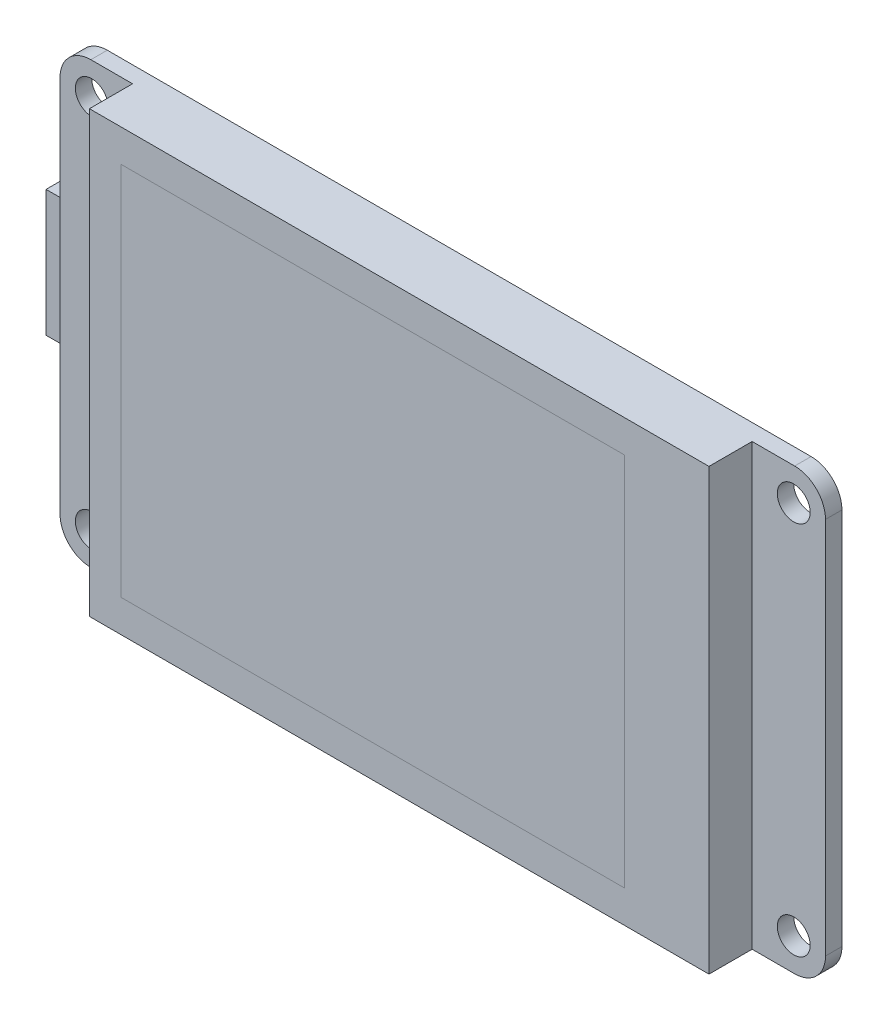
ISO-10303-21;
HEADER;
FILE_DESCRIPTION(('STEP AP214'),'2;1');
FILE_NAME('part.step','',(''),(''),'','','');
FILE_SCHEMA(('AUTOMOTIVE_DESIGN { 1 0 10303 214 1 1 1 1 }'));
ENDSEC;
DATA;
#1=APPLICATION_CONTEXT('core data for automotive mechanical design processes');
#2=APPLICATION_PROTOCOL_DEFINITION('international standard','automotive_design',2000,#1);
#3=PRODUCT_CONTEXT('',#1,'mechanical');
#4=PRODUCT('Part','Part','',(#3));
#5=PRODUCT_RELATED_PRODUCT_CATEGORY('part','',(#4));
#6=PRODUCT_DEFINITION_FORMATION('','',#4);
#7=PRODUCT_DEFINITION_CONTEXT('part definition',#1,'design');
#8=PRODUCT_DEFINITION('design','',#6,#7);
#9=PRODUCT_DEFINITION_SHAPE('','',#8);
#10=(LENGTH_UNIT() NAMED_UNIT(*) SI_UNIT(.MILLI.,.METRE.));
#11=(NAMED_UNIT(*) PLANE_ANGLE_UNIT() SI_UNIT($,.RADIAN.));
#12=(NAMED_UNIT(*) SI_UNIT($,.STERADIAN.) SOLID_ANGLE_UNIT());
#13=UNCERTAINTY_MEASURE_WITH_UNIT(LENGTH_MEASURE(1.E-05),#10,'distance_accuracy_value','');
#14=(GEOMETRIC_REPRESENTATION_CONTEXT(3) GLOBAL_UNCERTAINTY_ASSIGNED_CONTEXT((#13)) GLOBAL_UNIT_ASSIGNED_CONTEXT((#10,
#11,#12)) REPRESENTATION_CONTEXT('',''));
#15=CARTESIAN_POINT('',(0.,0.,0.));
#16=DIRECTION('',(0.,0.,1.));
#17=DIRECTION('',(1.,0.,0.));
#18=AXIS2_PLACEMENT_3D('',#15,#16,#17);
#19=CARTESIAN_POINT('',(37.25,-21.4,-1.6002));
#20=DIRECTION('',(0.,-1.,0.));
#21=DIRECTION('',(1.,0.,0.));
#22=AXIS2_PLACEMENT_3D('',#19,#20,#21);
#23=PLANE('',#22);
#24=DIRECTION('',(1.,0.,0.));
#25=VECTOR('',#24,1.);
#26=CARTESIAN_POINT('',(37.25,-21.4,-1.6002));
#27=LINE('',#26,#25);
#28=CARTESIAN_POINT('',(-34.25,-21.4,-1.6002));
#29=VERTEX_POINT('',#28);
#30=CARTESIAN_POINT('',(-23.45,-21.4,-1.6002));
#31=VERTEX_POINT('',#30);
#32=EDGE_CURVE('E495',#29,#31,#27,.T.);
#33=ORIENTED_EDGE('',*,*,#32,.T.);
#34=DIRECTION('',(0.,0.,1.));
#35=VECTOR('',#34,1.);
#36=CARTESIAN_POINT('',(-23.45,-21.4,-3.7502));
#37=LINE('',#36,#35);
#38=CARTESIAN_POINT('',(-23.45,-21.4,-3.7502));
#39=VERTEX_POINT('',#38);
#40=EDGE_CURVE('E284',#39,#31,#37,.T.);
#41=ORIENTED_EDGE('',*,*,#40,.F.);
#42=DIRECTION('',(-1.,0.,0.));
#43=VECTOR('',#42,1.);
#44=CARTESIAN_POINT('',(-23.45,-21.4,-3.7502));
#45=LINE('',#44,#43);
#46=CARTESIAN_POINT('',(-8.54999999999999,-21.4,-3.7502));
#47=VERTEX_POINT('',#46);
#48=EDGE_CURVE('E270',#47,#39,#45,.T.);
#49=ORIENTED_EDGE('',*,*,#48,.F.);
#50=DIRECTION('',(0.,0.,1.));
#51=VECTOR('',#50,1.);
#52=CARTESIAN_POINT('',(-8.54999999999999,-21.4,-3.7502));
#53=LINE('',#52,#51);
#54=CARTESIAN_POINT('',(-8.54999999999999,-21.4,-1.6002));
#55=VERTEX_POINT('',#54);
#56=EDGE_CURVE('E286',#47,#55,#53,.T.);
#57=ORIENTED_EDGE('',*,*,#56,.T.);
#58=CARTESIAN_POINT('',(34.25,-21.4,-1.6002));
#59=VERTEX_POINT('',#58);
#60=EDGE_CURVE('E491',#55,#59,#27,.T.);
#61=ORIENTED_EDGE('',*,*,#60,.T.);
#62=DIRECTION('',(0.,0.,1.));
#63=VECTOR('',#62,1.);
#64=CARTESIAN_POINT('',(34.25,-21.4,-1.6002));
#65=LINE('',#64,#63);
#66=CARTESIAN_POINT('',(34.25,-21.4,0.));
#67=VERTEX_POINT('',#66);
#68=EDGE_CURVE('E479',#59,#67,#65,.T.);
#69=ORIENTED_EDGE('',*,*,#68,.T.);
#70=DIRECTION('',(1.,0.,0.));
#71=VECTOR('',#70,1.);
#72=CARTESIAN_POINT('',(37.25,-21.4,0.));
#73=LINE('',#72,#71);
#74=CARTESIAN_POINT('',(30.11,-21.4,0.));
#75=VERTEX_POINT('',#74);
#76=EDGE_CURVE('E441',#75,#67,#73,.T.);
#77=ORIENTED_EDGE('',*,*,#76,.F.);
#78=DIRECTION('',(0.,0.,-1.));
#79=VECTOR('',#78,1.);
#80=CARTESIAN_POINT('',(30.11,-21.4,4.2));
#81=LINE('',#80,#79);
#82=CARTESIAN_POINT('',(30.11,-21.4,4.2));
#83=VERTEX_POINT('',#82);
#84=EDGE_CURVE('E450',#83,#75,#81,.T.);
#85=ORIENTED_EDGE('',*,*,#84,.F.);
#86=DIRECTION('',(1.,0.,0.));
#87=VECTOR('',#86,1.);
#88=CARTESIAN_POINT('',(30.11,-21.4,4.2));
#89=LINE('',#88,#87);
#90=CARTESIAN_POINT('',(-30.19,-21.4,4.2));
#91=VERTEX_POINT('',#90);
#92=EDGE_CURVE('E385',#91,#83,#89,.T.);
#93=ORIENTED_EDGE('',*,*,#92,.F.);
#94=DIRECTION('',(0.,0.,-1.));
#95=VECTOR('',#94,1.);
#96=CARTESIAN_POINT('',(-30.19,-21.4,4.2));
#97=LINE('',#96,#95);
#98=CARTESIAN_POINT('',(-30.19,-21.4,0.));
#99=VERTEX_POINT('',#98);
#100=EDGE_CURVE('E455',#91,#99,#97,.T.);
#101=ORIENTED_EDGE('',*,*,#100,.T.);
#102=CARTESIAN_POINT('',(-34.25,-21.4,0.));
#103=VERTEX_POINT('',#102);
#104=EDGE_CURVE('E467',#103,#99,#73,.T.);
#105=ORIENTED_EDGE('',*,*,#104,.F.);
#106=DIRECTION('',(0.,0.,1.));
#107=VECTOR('',#106,1.);
#108=CARTESIAN_POINT('',(-34.25,-21.4,-1.6002));
#109=LINE('',#108,#107);
#110=EDGE_CURVE('E477',#103,#29,#109,.F.);
#111=ORIENTED_EDGE('',*,*,#110,.T.);
#112=EDGE_LOOP('',(#33,#41,#49,#57,#61,#69,#77,#85,#93,#101,#105,#111));
#113=FACE_BOUND('',#112,.T.);
#114=DIRECTION('',(-1.,0.,0.));
#115=VECTOR('',#114,1.);
#116=CARTESIAN_POINT('',(-20.35,-21.4,-2.6402));
#117=LINE('',#116,#115);
#118=CARTESIAN_POINT('',(-9.31999999999999,-21.4,-2.6402));
#119=VERTEX_POINT('',#118);
#120=CARTESIAN_POINT('',(-20.35,-21.4,-2.6402));
#121=VERTEX_POINT('',#120);
#122=EDGE_CURVE('E798',#119,#121,#117,.T.);
#123=ORIENTED_EDGE('',*,*,#122,.F.);
#124=DIRECTION('',(0.,0.,1.));
#125=VECTOR('',#124,1.);
#126=CARTESIAN_POINT('',(-9.31999999999999,-21.4,-3.7402));
#127=LINE('',#126,#125);
#128=CARTESIAN_POINT('',(-9.31999999999999,-21.4,-3.7402));
#129=VERTEX_POINT('',#128);
#130=EDGE_CURVE('E259',#129,#119,#127,.T.);
#131=ORIENTED_EDGE('',*,*,#130,.F.);
#132=DIRECTION('',(1.,0.,0.));
#133=VECTOR('',#132,1.);
#134=CARTESIAN_POINT('',(-20.35,-21.4,-3.7402));
#135=LINE('',#134,#133);
#136=CARTESIAN_POINT('',(-20.35,-21.4,-3.7402));
#137=VERTEX_POINT('',#136);
#138=EDGE_CURVE('E255',#137,#129,#135,.T.);
#139=ORIENTED_EDGE('',*,*,#138,.F.);
#140=DIRECTION('',(0.,0.,-1.));
#141=VECTOR('',#140,1.);
#142=CARTESIAN_POINT('',(-20.35,-21.4,-3.7402));
#143=LINE('',#142,#141);
#144=EDGE_CURVE('E795',#121,#137,#143,.T.);
#145=ORIENTED_EDGE('',*,*,#144,.F.);
#146=EDGE_LOOP('',(#123,#131,#139,#145));
#147=FACE_BOUND('',#146,.T.);
#148=ADVANCED_FACE('F36',(#113,#147),#23,.T.);
#149=CARTESIAN_POINT('',(0.,0.,-1.6002));
#150=DIRECTION('',(0.,0.,1.));
#151=DIRECTION('',(1.,0.,0.));
#152=AXIS2_PLACEMENT_3D('',#149,#150,#151);
#153=PLANE('',#152);
#154=CARTESIAN_POINT('',(-34.16,18.245,-1.6002));
#155=DIRECTION('',(0.,0.,1.));
#156=DIRECTION('',(1.,0.,0.));
#157=AXIS2_PLACEMENT_3D('',#154,#155,#156);
#158=CIRCLE('',#157,1.6);
#159=CARTESIAN_POINT('',(-32.56,18.245,-1.6002));
#160=VERTEX_POINT('',#159);
#161=EDGE_CURVE('E360',#160,#160,#158,.T.);
#162=ORIENTED_EDGE('',*,*,#161,.T.);
#163=EDGE_LOOP('',(#162));
#164=FACE_BOUND('',#163,.T.);
#165=CARTESIAN_POINT('',(34.16,-18.245,-1.6002));
#166=DIRECTION('',(0.,0.,1.));
#167=DIRECTION('',(1.,0.,0.));
#168=AXIS2_PLACEMENT_3D('',#165,#166,#167);
#169=CIRCLE('',#168,1.6);
#170=CARTESIAN_POINT('',(35.76,-18.245,-1.6002));
#171=VERTEX_POINT('',#170);
#172=EDGE_CURVE('E366',#171,#171,#169,.T.);
#173=ORIENTED_EDGE('',*,*,#172,.T.);
#174=EDGE_LOOP('',(#173));
#175=FACE_BOUND('',#174,.T.);
#176=CARTESIAN_POINT('',(34.16,18.245,-1.6002));
#177=DIRECTION('',(0.,0.,1.));
#178=DIRECTION('',(1.,0.,0.));
#179=AXIS2_PLACEMENT_3D('',#176,#177,#178);
#180=CIRCLE('',#179,1.6);
#181=CARTESIAN_POINT('',(35.76,18.245,-1.6002));
#182=VERTEX_POINT('',#181);
#183=EDGE_CURVE('E372',#182,#182,#180,.T.);
#184=ORIENTED_EDGE('',*,*,#183,.T.);
#185=EDGE_LOOP('',(#184));
#186=FACE_BOUND('',#185,.T.);
#187=CARTESIAN_POINT('',(-34.16,-18.245,-1.6002));
#188=DIRECTION('',(0.,0.,1.));
#189=DIRECTION('',(1.,0.,0.));
#190=AXIS2_PLACEMENT_3D('',#187,#188,#189);
#191=CIRCLE('',#190,1.6);
#192=CARTESIAN_POINT('',(-32.56,-18.245,-1.6002));
#193=VERTEX_POINT('',#192);
#194=EDGE_CURVE('E378',#193,#193,#191,.T.);
#195=ORIENTED_EDGE('',*,*,#194,.T.);
#196=EDGE_LOOP('',(#195));
#197=FACE_BOUND('',#196,.T.);
#198=DIRECTION('',(0.,-1.,0.));
#199=VECTOR('',#198,1.);
#200=CARTESIAN_POINT('',(-8.54999999999999,-21.4,-1.6002));
#201=LINE('',#200,#199);
#202=CARTESIAN_POINT('',(-8.54999999999999,-6.65,-1.6002));
#203=VERTEX_POINT('',#202);
#204=EDGE_CURVE('E61',#203,#55,#201,.T.);
#205=ORIENTED_EDGE('',*,*,#204,.F.);
#206=DIRECTION('',(1.,0.,0.));
#207=VECTOR('',#206,1.);
#208=CARTESIAN_POINT('',(-23.45,-6.65,-1.6002));
#209=LINE('',#208,#207);
#210=CARTESIAN_POINT('',(-23.45,-6.65,-1.6002));
#211=VERTEX_POINT('',#210);
#212=EDGE_CURVE('E271',#211,#203,#209,.T.);
#213=ORIENTED_EDGE('',*,*,#212,.F.);
#214=DIRECTION('',(0.,1.,0.));
#215=VECTOR('',#214,1.);
#216=CARTESIAN_POINT('',(-23.45,-21.4,-1.6002));
#217=LINE('',#216,#215);
#218=EDGE_CURVE('E262',#31,#211,#217,.T.);
#219=ORIENTED_EDGE('',*,*,#218,.F.);
#220=ORIENTED_EDGE('',*,*,#32,.F.);
#221=CARTESIAN_POINT('',(-34.25,-18.4,-1.6002));
#222=DIRECTION('',(0.,0.,1.));
#223=DIRECTION('',(1.,0.,0.));
#224=AXIS2_PLACEMENT_3D('',#221,#222,#223);
#225=CIRCLE('',#224,3.);
#226=CARTESIAN_POINT('',(-37.25,-18.4,-1.6002));
#227=VERTEX_POINT('',#226);
#228=EDGE_CURVE('E525',#29,#227,#225,.F.);
#229=ORIENTED_EDGE('',*,*,#228,.T.);
#230=DIRECTION('',(0.,-1.,0.));
#231=VECTOR('',#230,1.);
#232=CARTESIAN_POINT('',(-37.25,-21.4,-1.6002));
#233=LINE('',#232,#231);
#234=CARTESIAN_POINT('',(-37.25,-7.49999999999999,-1.6002));
#235=VERTEX_POINT('',#234);
#236=EDGE_CURVE('E433',#235,#227,#233,.T.);
#237=ORIENTED_EDGE('',*,*,#236,.F.);
#238=DIRECTION('',(-1.,0.,0.));
#239=VECTOR('',#238,1.);
#240=CARTESIAN_POINT('',(-29.25,-7.49999999999999,-1.6002));
#241=LINE('',#240,#239);
#242=CARTESIAN_POINT('',(-29.25,-7.49999999999999,-1.6002));
#243=VERTEX_POINT('',#242);
#244=EDGE_CURVE('E322',#243,#235,#241,.T.);
#245=ORIENTED_EDGE('',*,*,#244,.F.);
#246=DIRECTION('',(0.,-1.,0.));
#247=VECTOR('',#246,1.);
#248=CARTESIAN_POINT('',(-29.25,-7.49999999999999,-1.6002));
#249=LINE('',#248,#247);
#250=CARTESIAN_POINT('',(-29.25,7.50000000000001,-1.6002));
#251=VERTEX_POINT('',#250);
#252=EDGE_CURVE('E329',#251,#243,#249,.T.);
#253=ORIENTED_EDGE('',*,*,#252,.F.);
#254=DIRECTION('',(1.,0.,0.));
#255=VECTOR('',#254,1.);
#256=CARTESIAN_POINT('',(-29.25,7.50000000000001,-1.6002));
#257=LINE('',#256,#255);
#258=CARTESIAN_POINT('',(-37.25,7.50000000000001,-1.6002));
#259=VERTEX_POINT('',#258);
#260=EDGE_CURVE('E317',#259,#251,#257,.T.);
#261=ORIENTED_EDGE('',*,*,#260,.F.);
#262=CARTESIAN_POINT('',(-37.25,18.4,-1.6002));
#263=VERTEX_POINT('',#262);
#264=EDGE_CURVE('E488',#263,#259,#233,.T.);
#265=ORIENTED_EDGE('',*,*,#264,.F.);
#266=CARTESIAN_POINT('',(-34.25,18.4,-1.6002));
#267=DIRECTION('',(0.,0.,1.));
#268=DIRECTION('',(1.,0.,0.));
#269=AXIS2_PLACEMENT_3D('',#266,#267,#268);
#270=CIRCLE('',#269,3.);
#271=CARTESIAN_POINT('',(-34.25,21.4,-1.6002));
#272=VERTEX_POINT('',#271);
#273=EDGE_CURVE('E519',#263,#272,#270,.F.);
#274=ORIENTED_EDGE('',*,*,#273,.T.);
#275=DIRECTION('',(-1.,0.,0.));
#276=VECTOR('',#275,1.);
#277=CARTESIAN_POINT('',(37.25,21.4,-1.6002));
#278=LINE('',#277,#276);
#279=CARTESIAN_POINT('',(34.25,21.4,-1.6002));
#280=VERTEX_POINT('',#279);
#281=EDGE_CURVE('E413',#280,#272,#278,.T.);
#282=ORIENTED_EDGE('',*,*,#281,.F.);
#283=CARTESIAN_POINT('',(34.25,18.4,-1.6002));
#284=DIRECTION('',(0.,0.,1.));
#285=DIRECTION('',(1.,0.,0.));
#286=AXIS2_PLACEMENT_3D('',#283,#284,#285);
#287=CIRCLE('',#286,3.);
#288=CARTESIAN_POINT('',(37.25,18.4,-1.6002));
#289=VERTEX_POINT('',#288);
#290=EDGE_CURVE('E475',#280,#289,#287,.F.);
#291=ORIENTED_EDGE('',*,*,#290,.T.);
#292=DIRECTION('',(0.,1.,0.));
#293=VECTOR('',#292,1.);
#294=CARTESIAN_POINT('',(37.25,-21.4,-1.6002));
#295=LINE('',#294,#293);
#296=CARTESIAN_POINT('',(37.25,-18.4,-1.6002));
#297=VERTEX_POINT('',#296);
#298=EDGE_CURVE('E498',#297,#289,#295,.T.);
#299=ORIENTED_EDGE('',*,*,#298,.F.);
#300=CARTESIAN_POINT('',(34.25,-18.4,-1.6002));
#301=DIRECTION('',(0.,0.,1.));
#302=DIRECTION('',(1.,0.,0.));
#303=AXIS2_PLACEMENT_3D('',#300,#301,#302);
#304=CIRCLE('',#303,3.);
#305=EDGE_CURVE('E527',#297,#59,#304,.F.);
#306=ORIENTED_EDGE('',*,*,#305,.T.);
#307=ORIENTED_EDGE('',*,*,#60,.F.);
#308=EDGE_LOOP('',(#205,#213,#219,#220,#229,#237,#245,#253,#261,#265,#274,#282,#291,#299,#306,#307));
#309=FACE_BOUND('',#308,.T.);
#310=ADVANCED_FACE('F532',(#164,#175,#186,#197,#309),#153,.F.);
#311=CARTESIAN_POINT('',(-37.25,-21.4,-1.6002));
#312=DIRECTION('',(-1.,0.,0.));
#313=DIRECTION('',(0.,0.,1.));
#314=AXIS2_PLACEMENT_3D('',#311,#312,#313);
#315=PLANE('',#314);
#316=ORIENTED_EDGE('',*,*,#264,.T.);
#317=DIRECTION('',(0.,0.,1.));
#318=VECTOR('',#317,1.);
#319=CARTESIAN_POINT('',(-37.25,7.50000000000001,-7.8502));
#320=LINE('',#319,#318);
#321=CARTESIAN_POINT('',(-37.25,7.50000000000001,-7.8502));
#322=VERTEX_POINT('',#321);
#323=EDGE_CURVE('E351',#322,#259,#320,.T.);
#324=ORIENTED_EDGE('',*,*,#323,.F.);
#325=DIRECTION('',(0.,1.,0.));
#326=VECTOR('',#325,1.);
#327=CARTESIAN_POINT('',(-37.25,-7.49999999999999,-7.8502));
#328=LINE('',#327,#326);
#329=CARTESIAN_POINT('',(-37.25,-7.49999999999999,-7.8502));
#330=VERTEX_POINT('',#329);
#331=EDGE_CURVE('E318',#330,#322,#328,.T.);
#332=ORIENTED_EDGE('',*,*,#331,.F.);
#333=DIRECTION('',(0.,0.,1.));
#334=VECTOR('',#333,1.);
#335=CARTESIAN_POINT('',(-37.25,-7.49999999999999,-7.8502));
#336=LINE('',#335,#334);
#337=EDGE_CURVE('E328',#330,#235,#336,.T.);
#338=ORIENTED_EDGE('',*,*,#337,.T.);
#339=ORIENTED_EDGE('',*,*,#236,.T.);
#340=DIRECTION('',(0.,0.,1.));
#341=VECTOR('',#340,1.);
#342=CARTESIAN_POINT('',(-37.25,-18.4,-1.6002));
#343=LINE('',#342,#341);
#344=CARTESIAN_POINT('',(-37.25,-18.4,0.));
#345=VERTEX_POINT('',#344);
#346=EDGE_CURVE('E484',#227,#345,#343,.T.);
#347=ORIENTED_EDGE('',*,*,#346,.T.);
#348=DIRECTION('',(0.,-1.,0.));
#349=VECTOR('',#348,1.);
#350=CARTESIAN_POINT('',(-37.25,-21.4,0.));
#351=LINE('',#350,#349);
#352=CARTESIAN_POINT('',(-37.25,18.4,0.));
#353=VERTEX_POINT('',#352);
#354=EDGE_CURVE('E458',#353,#345,#351,.T.);
#355=ORIENTED_EDGE('',*,*,#354,.F.);
#356=DIRECTION('',(0.,0.,1.));
#357=VECTOR('',#356,1.);
#358=CARTESIAN_POINT('',(-37.25,18.4,-1.6002));
#359=LINE('',#358,#357);
#360=EDGE_CURVE('E482',#353,#263,#359,.F.);
#361=ORIENTED_EDGE('',*,*,#360,.T.);
#362=EDGE_LOOP('',(#316,#324,#332,#338,#339,#347,#355,#361));
#363=FACE_BOUND('',#362,.T.);
#364=DIRECTION('',(0.,0.,1.));
#365=VECTOR('',#364,1.);
#366=CARTESIAN_POINT('',(-37.25,-6.15,-2.1402));
#367=LINE('',#366,#365);
#368=CARTESIAN_POINT('',(-37.25,-6.15,-7.8402));
#369=VERTEX_POINT('',#368);
#370=CARTESIAN_POINT('',(-37.25,-6.15,-2.1402));
#371=VERTEX_POINT('',#370);
#372=EDGE_CURVE('E302',#369,#371,#367,.T.);
#373=ORIENTED_EDGE('',*,*,#372,.F.);
#374=DIRECTION('',(0.,-1.,0.));
#375=VECTOR('',#374,1.);
#376=CARTESIAN_POINT('',(-37.25,-6.15,-7.8402));
#377=LINE('',#376,#375);
#378=CARTESIAN_POINT('',(-37.25,6.15,-7.8402));
#379=VERTEX_POINT('',#378);
#380=EDGE_CURVE('E288',#379,#369,#377,.T.);
#381=ORIENTED_EDGE('',*,*,#380,.F.);
#382=DIRECTION('',(0.,0.,-1.));
#383=VECTOR('',#382,1.);
#384=CARTESIAN_POINT('',(-37.25,6.15,-2.1402));
#385=LINE('',#384,#383);
#386=CARTESIAN_POINT('',(-37.25,6.15,-2.1402));
#387=VERTEX_POINT('',#386);
#388=EDGE_CURVE('E293',#387,#379,#385,.T.);
#389=ORIENTED_EDGE('',*,*,#388,.F.);
#390=DIRECTION('',(0.,1.,0.));
#391=VECTOR('',#390,1.);
#392=CARTESIAN_POINT('',(-37.25,-6.15,-2.1402));
#393=LINE('',#392,#391);
#394=EDGE_CURVE('E304',#371,#387,#393,.T.);
#395=ORIENTED_EDGE('',*,*,#394,.F.);
#396=EDGE_LOOP('',(#373,#381,#389,#395));
#397=FACE_BOUND('',#396,.T.);
#398=ADVANCED_FACE('F567',(#363,#397),#315,.T.);
#399=CARTESIAN_POINT('',(0.,0.,4.2));
#400=DIRECTION('',(0.,0.,1.));
#401=DIRECTION('',(1.,0.,0.));
#402=AXIS2_PLACEMENT_3D('',#399,#400,#401);
#403=PLANE('',#402);
#404=DIRECTION('',(0.,-1.,0.));
#405=VECTOR('',#404,1.);
#406=CARTESIAN_POINT('',(-30.19,-21.4,4.2));
#407=LINE('',#406,#405);
#408=CARTESIAN_POINT('',(-30.19,21.4,4.2));
#409=VERTEX_POINT('',#408);
#410=EDGE_CURVE('E382',#409,#91,#407,.T.);
#411=ORIENTED_EDGE('',*,*,#410,.T.);
#412=ORIENTED_EDGE('',*,*,#92,.T.);
#413=DIRECTION('',(0.,1.,0.));
#414=VECTOR('',#413,1.);
#415=CARTESIAN_POINT('',(30.11,-21.4,4.2));
#416=LINE('',#415,#414);
#417=CARTESIAN_POINT('',(30.11,21.4,4.2));
#418=VERTEX_POINT('',#417);
#419=EDGE_CURVE('E388',#83,#418,#416,.T.);
#420=ORIENTED_EDGE('',*,*,#419,.T.);
#421=DIRECTION('',(-1.,0.,0.));
#422=VECTOR('',#421,1.);
#423=CARTESIAN_POINT('',(30.11,21.4,4.2));
#424=LINE('',#423,#422);
#425=EDGE_CURVE('E390',#418,#409,#424,.T.);
#426=ORIENTED_EDGE('',*,*,#425,.T.);
#427=EDGE_LOOP('',(#411,#412,#420,#426));
#428=FACE_BOUND('',#427,.T.);
#429=DIRECTION('',(-1.,0.,0.));
#430=VECTOR('',#429,1.);
#431=CARTESIAN_POINT('',(0.,-18.25,4.2));
#432=LINE('',#431,#430);
#433=CARTESIAN_POINT('',(21.89,-18.25,4.2));
#434=VERTEX_POINT('',#433);
#435=CARTESIAN_POINT('',(-27.11,-18.25,4.2));
#436=VERTEX_POINT('',#435);
#437=EDGE_CURVE('E417',#434,#436,#432,.T.);
#438=ORIENTED_EDGE('',*,*,#437,.T.);
#439=DIRECTION('',(0.,1.,0.));
#440=VECTOR('',#439,1.);
#441=CARTESIAN_POINT('',(-27.11,0.,4.2));
#442=LINE('',#441,#440);
#443=CARTESIAN_POINT('',(-27.11,18.25,4.2));
#444=VERTEX_POINT('',#443);
#445=EDGE_CURVE('E421',#436,#444,#442,.T.);
#446=ORIENTED_EDGE('',*,*,#445,.T.);
#447=DIRECTION('',(1.,0.,0.));
#448=VECTOR('',#447,1.);
#449=CARTESIAN_POINT('',(0.,18.25,4.2));
#450=LINE('',#449,#448);
#451=CARTESIAN_POINT('',(21.89,18.25,4.2));
#452=VERTEX_POINT('',#451);
#453=EDGE_CURVE('E408',#444,#452,#450,.T.);
#454=ORIENTED_EDGE('',*,*,#453,.T.);
#455=DIRECTION('',(0.,-1.,0.));
#456=VECTOR('',#455,1.);
#457=CARTESIAN_POINT('',(21.89,0.,4.2));
#458=LINE('',#457,#456);
#459=EDGE_CURVE('E412',#452,#434,#458,.T.);
#460=ORIENTED_EDGE('',*,*,#459,.T.);
#461=EDGE_LOOP('',(#438,#446,#454,#460));
#462=FACE_BOUND('',#461,.T.);
#463=ADVANCED_FACE('F600',(#428,#462),#403,.T.);
#464=CARTESIAN_POINT('',(0.,0.,0.));
#465=DIRECTION('',(0.,0.,1.));
#466=DIRECTION('',(1.,0.,0.));
#467=AXIS2_PLACEMENT_3D('',#464,#465,#466);
#468=PLANE('',#467);
#469=CARTESIAN_POINT('',(-34.16,18.245,0.));
#470=DIRECTION('',(0.,0.,1.));
#471=DIRECTION('',(1.,0.,0.));
#472=AXIS2_PLACEMENT_3D('',#469,#470,#471);
#473=CIRCLE('',#472,1.6);
#474=CARTESIAN_POINT('',(-32.56,18.245,0.));
#475=VERTEX_POINT('',#474);
#476=EDGE_CURVE('E356',#475,#475,#473,.T.);
#477=ORIENTED_EDGE('',*,*,#476,.F.);
#478=EDGE_LOOP('',(#477));
#479=FACE_BOUND('',#478,.T.);
#480=CARTESIAN_POINT('',(-34.16,-18.245,0.));
#481=DIRECTION('',(0.,0.,1.));
#482=DIRECTION('',(1.,0.,0.));
#483=AXIS2_PLACEMENT_3D('',#480,#481,#482);
#484=CIRCLE('',#483,1.6);
#485=CARTESIAN_POINT('',(-32.56,-18.245,0.));
#486=VERTEX_POINT('',#485);
#487=EDGE_CURVE('E375',#486,#486,#484,.T.);
#488=ORIENTED_EDGE('',*,*,#487,.F.);
#489=EDGE_LOOP('',(#488));
#490=FACE_BOUND('',#489,.T.);
#491=ORIENTED_EDGE('',*,*,#354,.T.);
#492=CARTESIAN_POINT('',(-34.25,-18.4,0.));
#493=DIRECTION('',(0.,0.,1.));
#494=DIRECTION('',(1.,0.,0.));
#495=AXIS2_PLACEMENT_3D('',#492,#493,#494);
#496=CIRCLE('',#495,3.);
#497=EDGE_CURVE('E11',#345,#103,#496,.T.);
#498=ORIENTED_EDGE('',*,*,#497,.T.);
#499=ORIENTED_EDGE('',*,*,#104,.T.);
#500=DIRECTION('',(0.,-1.,0.));
#501=VECTOR('',#500,1.);
#502=CARTESIAN_POINT('',(-30.19,-21.4,0.));
#503=LINE('',#502,#501);
#504=CARTESIAN_POINT('',(-30.19,21.4,0.));
#505=VERTEX_POINT('',#504);
#506=EDGE_CURVE('E381',#505,#99,#503,.T.);
#507=ORIENTED_EDGE('',*,*,#506,.F.);
#508=DIRECTION('',(-1.,0.,0.));
#509=VECTOR('',#508,1.);
#510=CARTESIAN_POINT('',(37.25,21.4,0.));
#511=LINE('',#510,#509);
#512=CARTESIAN_POINT('',(-34.25,21.4,0.));
#513=VERTEX_POINT('',#512);
#514=EDGE_CURVE('E434',#505,#513,#511,.T.);
#515=ORIENTED_EDGE('',*,*,#514,.T.);
#516=CARTESIAN_POINT('',(-34.25,18.4,0.));
#517=DIRECTION('',(0.,0.,1.));
#518=DIRECTION('',(1.,0.,0.));
#519=AXIS2_PLACEMENT_3D('',#516,#517,#518);
#520=CIRCLE('',#519,3.);
#521=EDGE_CURVE('E45',#513,#353,#520,.T.);
#522=ORIENTED_EDGE('',*,*,#521,.T.);
#523=EDGE_LOOP('',(#491,#498,#499,#507,#515,#522));
#524=FACE_BOUND('',#523,.T.);
#525=ADVANCED_FACE('F815',(#479,#490,#524),#468,.T.);
#526=CARTESIAN_POINT('',(37.25,21.4,-1.6002));
#527=DIRECTION('',(0.,1.,0.));
#528=DIRECTION('',(-1.,0.,0.));
#529=AXIS2_PLACEMENT_3D('',#526,#527,#528);
#530=PLANE('',#529);
#531=CARTESIAN_POINT('',(34.25,21.4,0.));
#532=VERTEX_POINT('',#531);
#533=CARTESIAN_POINT('',(30.11,21.4,0.));
#534=VERTEX_POINT('',#533);
#535=EDGE_CURVE('E430',#532,#534,#511,.T.);
#536=ORIENTED_EDGE('',*,*,#535,.F.);
#537=DIRECTION('',(0.,0.,1.));
#538=VECTOR('',#537,1.);
#539=CARTESIAN_POINT('',(34.25,21.4,-1.6002));
#540=LINE('',#539,#538);
#541=EDGE_CURVE('E513',#532,#280,#540,.F.);
#542=ORIENTED_EDGE('',*,*,#541,.T.);
#543=ORIENTED_EDGE('',*,*,#281,.T.);
#544=DIRECTION('',(0.,0.,1.));
#545=VECTOR('',#544,1.);
#546=CARTESIAN_POINT('',(-34.25,21.4,-1.6002));
#547=LINE('',#546,#545);
#548=EDGE_CURVE('E511',#272,#513,#547,.T.);
#549=ORIENTED_EDGE('',*,*,#548,.T.);
#550=ORIENTED_EDGE('',*,*,#514,.F.);
#551=DIRECTION('',(0.,0.,-1.));
#552=VECTOR('',#551,1.);
#553=CARTESIAN_POINT('',(-30.19,21.4,4.2));
#554=LINE('',#553,#552);
#555=EDGE_CURVE('E392',#409,#505,#554,.T.);
#556=ORIENTED_EDGE('',*,*,#555,.F.);
#557=ORIENTED_EDGE('',*,*,#425,.F.);
#558=DIRECTION('',(0.,0.,-1.));
#559=VECTOR('',#558,1.);
#560=CARTESIAN_POINT('',(30.11,21.4,4.2));
#561=LINE('',#560,#559);
#562=EDGE_CURVE('E405',#418,#534,#561,.T.);
#563=ORIENTED_EDGE('',*,*,#562,.T.);
#564=EDGE_LOOP('',(#536,#542,#543,#549,#550,#556,#557,#563));
#565=FACE_BOUND('',#564,.T.);
#566=ADVANCED_FACE('F509',(#565),#530,.T.);
#567=CARTESIAN_POINT('',(37.25,-21.4,-1.6002));
#568=DIRECTION('',(1.,0.,0.));
#569=DIRECTION('',(0.,0.,-1.));
#570=AXIS2_PLACEMENT_3D('',#567,#568,#569);
#571=PLANE('',#570);
#572=ORIENTED_EDGE('',*,*,#298,.T.);
#573=DIRECTION('',(0.,0.,1.));
#574=VECTOR('',#573,1.);
#575=CARTESIAN_POINT('',(37.25,18.4,-1.6002));
#576=LINE('',#575,#574);
#577=CARTESIAN_POINT('',(37.25,18.4,0.));
#578=VERTEX_POINT('',#577);
#579=EDGE_CURVE('E426',#289,#578,#576,.T.);
#580=ORIENTED_EDGE('',*,*,#579,.T.);
#581=DIRECTION('',(0.,1.,0.));
#582=VECTOR('',#581,1.);
#583=CARTESIAN_POINT('',(37.25,-21.4,0.));
#584=LINE('',#583,#582);
#585=CARTESIAN_POINT('',(37.25,-18.4,0.));
#586=VERTEX_POINT('',#585);
#587=EDGE_CURVE('E439',#586,#578,#584,.T.);
#588=ORIENTED_EDGE('',*,*,#587,.F.);
#589=DIRECTION('',(0.,0.,1.));
#590=VECTOR('',#589,1.);
#591=CARTESIAN_POINT('',(37.25,-18.4,-1.6002));
#592=LINE('',#591,#590);
#593=EDGE_CURVE('E424',#586,#297,#592,.F.);
#594=ORIENTED_EDGE('',*,*,#593,.T.);
#595=EDGE_LOOP('',(#572,#580,#588,#594));
#596=FACE_BOUND('',#595,.T.);
#597=ADVANCED_FACE('F537',(#596),#571,.T.);
#598=CARTESIAN_POINT('',(34.16,-18.245,0.));
#599=DIRECTION('',(0.,0.,1.));
#600=DIRECTION('',(1.,0.,0.));
#601=AXIS2_PLACEMENT_3D('',#598,#599,#600);
#602=CIRCLE('',#601,1.6);
#603=CARTESIAN_POINT('',(35.76,-18.245,0.));
#604=VERTEX_POINT('',#603);
#605=EDGE_CURVE('E363',#604,#604,#602,.T.);
#606=ORIENTED_EDGE('',*,*,#605,.F.);
#607=EDGE_LOOP('',(#606));
#608=FACE_BOUND('',#607,.T.);
#609=CARTESIAN_POINT('',(34.16,18.245,0.));
#610=DIRECTION('',(0.,0.,1.));
#611=DIRECTION('',(1.,0.,0.));
#612=AXIS2_PLACEMENT_3D('',#609,#610,#611);
#613=CIRCLE('',#612,1.6);
#614=CARTESIAN_POINT('',(35.76,18.245,0.));
#615=VERTEX_POINT('',#614);
#616=EDGE_CURVE('E369',#615,#615,#613,.T.);
#617=ORIENTED_EDGE('',*,*,#616,.F.);
#618=EDGE_LOOP('',(#617));
#619=FACE_BOUND('',#618,.T.);
#620=ORIENTED_EDGE('',*,*,#587,.T.);
#621=CARTESIAN_POINT('',(34.25,18.4,0.));
#622=DIRECTION('',(0.,0.,1.));
#623=DIRECTION('',(1.,0.,0.));
#624=AXIS2_PLACEMENT_3D('',#621,#622,#623);
#625=CIRCLE('',#624,3.);
#626=EDGE_CURVE('E520',#578,#532,#625,.T.);
#627=ORIENTED_EDGE('',*,*,#626,.T.);
#628=ORIENTED_EDGE('',*,*,#535,.T.);
#629=DIRECTION('',(0.,1.,0.));
#630=VECTOR('',#629,1.);
#631=CARTESIAN_POINT('',(30.11,-21.4,0.));
#632=LINE('',#631,#630);
#633=EDGE_CURVE('E386',#75,#534,#632,.T.);
#634=ORIENTED_EDGE('',*,*,#633,.F.);
#635=ORIENTED_EDGE('',*,*,#76,.T.);
#636=CARTESIAN_POINT('',(34.25,-18.4,0.));
#637=DIRECTION('',(0.,0.,1.));
#638=DIRECTION('',(1.,0.,0.));
#639=AXIS2_PLACEMENT_3D('',#636,#637,#638);
#640=CIRCLE('',#639,3.);
#641=EDGE_CURVE('E429',#67,#586,#640,.T.);
#642=ORIENTED_EDGE('',*,*,#641,.T.);
#643=EDGE_LOOP('',(#620,#627,#628,#634,#635,#642));
#644=FACE_BOUND('',#643,.T.);
#645=ADVANCED_FACE('F540',(#608,#619,#644),#468,.T.);
#646=CARTESIAN_POINT('',(-30.19,-21.4,4.2));
#647=DIRECTION('',(1.,0.,0.));
#648=DIRECTION('',(0.,0.,-1.));
#649=AXIS2_PLACEMENT_3D('',#646,#647,#648);
#650=PLANE('',#649);
#651=ORIENTED_EDGE('',*,*,#506,.T.);
#652=ORIENTED_EDGE('',*,*,#100,.F.);
#653=ORIENTED_EDGE('',*,*,#410,.F.);
#654=ORIENTED_EDGE('',*,*,#555,.T.);
#655=EDGE_LOOP('',(#651,#652,#653,#654));
#656=FACE_BOUND('',#655,.T.);
#657=ADVANCED_FACE('F844',(#656),#650,.F.);
#658=CARTESIAN_POINT('',(30.11,-21.4,4.2));
#659=DIRECTION('',(-1.,0.,0.));
#660=DIRECTION('',(0.,0.,1.));
#661=AXIS2_PLACEMENT_3D('',#658,#659,#660);
#662=PLANE('',#661);
#663=ORIENTED_EDGE('',*,*,#633,.T.);
#664=ORIENTED_EDGE('',*,*,#562,.F.);
#665=ORIENTED_EDGE('',*,*,#419,.F.);
#666=ORIENTED_EDGE('',*,*,#84,.T.);
#667=EDGE_LOOP('',(#663,#664,#665,#666));
#668=FACE_BOUND('',#667,.T.);
#669=ADVANCED_FACE('F851',(#668),#662,.F.);
#670=ORIENTED_EDGE('',*,*,#445,.F.);
#671=ORIENTED_EDGE('',*,*,#437,.F.);
#672=ORIENTED_EDGE('',*,*,#459,.F.);
#673=ORIENTED_EDGE('',*,*,#453,.F.);
#674=EDGE_LOOP('',(#670,#671,#672,#673));
#675=FACE_BOUND('',#674,.T.);
#676=ADVANCED_FACE('F818',(#675),#403,.T.);
#677=CARTESIAN_POINT('',(-34.16,-18.245,0.));
#678=DIRECTION('',(0.,0.,1.));
#679=DIRECTION('',(1.,0.,0.));
#680=AXIS2_PLACEMENT_3D('',#677,#678,#679);
#681=CYLINDRICAL_SURFACE('',#680,1.6);
#682=ORIENTED_EDGE('',*,*,#194,.F.);
#683=EDGE_LOOP('',(#682));
#684=FACE_BOUND('',#683,.T.);
#685=ORIENTED_EDGE('',*,*,#487,.T.);
#686=EDGE_LOOP('',(#685));
#687=FACE_BOUND('',#686,.T.);
#688=ADVANCED_FACE('F865',(#684,#687),#681,.F.);
#689=CARTESIAN_POINT('',(34.16,18.245,0.));
#690=DIRECTION('',(0.,0.,1.));
#691=DIRECTION('',(1.,0.,0.));
#692=AXIS2_PLACEMENT_3D('',#689,#690,#691);
#693=CYLINDRICAL_SURFACE('',#692,1.6);
#694=ORIENTED_EDGE('',*,*,#183,.F.);
#695=EDGE_LOOP('',(#694));
#696=FACE_BOUND('',#695,.T.);
#697=ORIENTED_EDGE('',*,*,#616,.T.);
#698=EDGE_LOOP('',(#697));
#699=FACE_BOUND('',#698,.T.);
#700=ADVANCED_FACE('F871',(#696,#699),#693,.F.);
#701=CARTESIAN_POINT('',(34.16,-18.245,0.));
#702=DIRECTION('',(0.,0.,1.));
#703=DIRECTION('',(1.,0.,0.));
#704=AXIS2_PLACEMENT_3D('',#701,#702,#703);
#705=CYLINDRICAL_SURFACE('',#704,1.6);
#706=ORIENTED_EDGE('',*,*,#172,.F.);
#707=EDGE_LOOP('',(#706));
#708=FACE_BOUND('',#707,.T.);
#709=ORIENTED_EDGE('',*,*,#605,.T.);
#710=EDGE_LOOP('',(#709));
#711=FACE_BOUND('',#710,.T.);
#712=ADVANCED_FACE('F879',(#708,#711),#705,.F.);
#713=CARTESIAN_POINT('',(-34.16,18.245,0.));
#714=DIRECTION('',(0.,0.,1.));
#715=DIRECTION('',(1.,0.,0.));
#716=AXIS2_PLACEMENT_3D('',#713,#714,#715);
#717=CYLINDRICAL_SURFACE('',#716,1.6);
#718=ORIENTED_EDGE('',*,*,#161,.F.);
#719=EDGE_LOOP('',(#718));
#720=FACE_BOUND('',#719,.T.);
#721=ORIENTED_EDGE('',*,*,#476,.T.);
#722=EDGE_LOOP('',(#721));
#723=FACE_BOUND('',#722,.T.);
#724=ADVANCED_FACE('F603',(#720,#723),#717,.F.);
#725=CARTESIAN_POINT('',(34.25,18.4,-1.6002));
#726=DIRECTION('',(0.,0.,1.));
#727=DIRECTION('',(1.,0.,0.));
#728=AXIS2_PLACEMENT_3D('',#725,#726,#727);
#729=CYLINDRICAL_SURFACE('',#728,3.);
#730=ORIENTED_EDGE('',*,*,#290,.F.);
#731=ORIENTED_EDGE('',*,*,#541,.F.);
#732=ORIENTED_EDGE('',*,*,#626,.F.);
#733=ORIENTED_EDGE('',*,*,#579,.F.);
#734=EDGE_LOOP('',(#730,#731,#732,#733));
#735=FACE_BOUND('',#734,.T.);
#736=ADVANCED_FACE('F534',(#735),#729,.T.);
#737=CARTESIAN_POINT('',(34.25,-18.4,-1.6002));
#738=DIRECTION('',(0.,0.,1.));
#739=DIRECTION('',(1.,0.,0.));
#740=AXIS2_PLACEMENT_3D('',#737,#738,#739);
#741=CYLINDRICAL_SURFACE('',#740,3.);
#742=ORIENTED_EDGE('',*,*,#305,.F.);
#743=ORIENTED_EDGE('',*,*,#593,.F.);
#744=ORIENTED_EDGE('',*,*,#641,.F.);
#745=ORIENTED_EDGE('',*,*,#68,.F.);
#746=EDGE_LOOP('',(#742,#743,#744,#745));
#747=FACE_BOUND('',#746,.T.);
#748=ADVANCED_FACE('F543',(#747),#741,.T.);
#749=CARTESIAN_POINT('',(-34.25,-18.4,-1.6002));
#750=DIRECTION('',(0.,0.,1.));
#751=DIRECTION('',(1.,0.,0.));
#752=AXIS2_PLACEMENT_3D('',#749,#750,#751);
#753=CYLINDRICAL_SURFACE('',#752,3.);
#754=ORIENTED_EDGE('',*,*,#228,.F.);
#755=ORIENTED_EDGE('',*,*,#110,.F.);
#756=ORIENTED_EDGE('',*,*,#497,.F.);
#757=ORIENTED_EDGE('',*,*,#346,.F.);
#758=EDGE_LOOP('',(#754,#755,#756,#757));
#759=FACE_BOUND('',#758,.T.);
#760=ADVANCED_FACE('F566',(#759),#753,.T.);
#761=CARTESIAN_POINT('',(-34.25,18.4,-1.6002));
#762=DIRECTION('',(0.,0.,1.));
#763=DIRECTION('',(1.,0.,0.));
#764=AXIS2_PLACEMENT_3D('',#761,#762,#763);
#765=CYLINDRICAL_SURFACE('',#764,3.);
#766=ORIENTED_EDGE('',*,*,#273,.F.);
#767=ORIENTED_EDGE('',*,*,#360,.F.);
#768=ORIENTED_EDGE('',*,*,#521,.F.);
#769=ORIENTED_EDGE('',*,*,#548,.F.);
#770=EDGE_LOOP('',(#766,#767,#768,#769));
#771=FACE_BOUND('',#770,.T.);
#772=ADVANCED_FACE('F38',(#771),#765,.T.);
#773=CARTESIAN_POINT('',(-29.25,7.50000000000001,-7.8502));
#774=DIRECTION('',(0.,-1.,0.));
#775=DIRECTION('',(0.,0.,-1.));
#776=AXIS2_PLACEMENT_3D('',#773,#774,#775);
#777=PLANE('',#776);
#778=ORIENTED_EDGE('',*,*,#260,.T.);
#779=DIRECTION('',(0.,0.,1.));
#780=VECTOR('',#779,1.);
#781=CARTESIAN_POINT('',(-29.25,7.50000000000001,-7.8502));
#782=LINE('',#781,#780);
#783=CARTESIAN_POINT('',(-29.25,7.50000000000001,-7.8502));
#784=VERTEX_POINT('',#783);
#785=EDGE_CURVE('E346',#784,#251,#782,.T.);
#786=ORIENTED_EDGE('',*,*,#785,.F.);
#787=DIRECTION('',(1.,0.,0.));
#788=VECTOR('',#787,1.);
#789=CARTESIAN_POINT('',(-29.25,7.50000000000001,-7.8502));
#790=LINE('',#789,#788);
#791=EDGE_CURVE('E321',#322,#784,#790,.T.);
#792=ORIENTED_EDGE('',*,*,#791,.F.);
#793=ORIENTED_EDGE('',*,*,#323,.T.);
#794=EDGE_LOOP('',(#778,#786,#792,#793));
#795=FACE_BOUND('',#794,.T.);
#796=ADVANCED_FACE('F577',(#795),#777,.F.);
#797=CARTESIAN_POINT('',(-29.25,-7.49999999999999,-7.8502));
#798=DIRECTION('',(-1.,0.,0.));
#799=DIRECTION('',(0.,0.,1.));
#800=AXIS2_PLACEMENT_3D('',#797,#798,#799);
#801=PLANE('',#800);
#802=ORIENTED_EDGE('',*,*,#252,.T.);
#803=DIRECTION('',(0.,0.,1.));
#804=VECTOR('',#803,1.);
#805=CARTESIAN_POINT('',(-29.25,-7.49999999999999,-7.8502));
#806=LINE('',#805,#804);
#807=CARTESIAN_POINT('',(-29.25,-7.49999999999999,-7.8502));
#808=VERTEX_POINT('',#807);
#809=EDGE_CURVE('E334',#808,#243,#806,.T.);
#810=ORIENTED_EDGE('',*,*,#809,.F.);
#811=DIRECTION('',(0.,-1.,0.));
#812=VECTOR('',#811,1.);
#813=CARTESIAN_POINT('',(-29.25,-7.49999999999999,-7.8502));
#814=LINE('',#813,#812);
#815=EDGE_CURVE('E324',#784,#808,#814,.T.);
#816=ORIENTED_EDGE('',*,*,#815,.F.);
#817=ORIENTED_EDGE('',*,*,#785,.T.);
#818=EDGE_LOOP('',(#802,#810,#816,#817));
#819=FACE_BOUND('',#818,.T.);
#820=ADVANCED_FACE('F573',(#819),#801,.F.);
#821=CARTESIAN_POINT('',(-29.25,-7.49999999999999,-7.8502));
#822=DIRECTION('',(0.,1.,0.));
#823=DIRECTION('',(0.,0.,1.));
#824=AXIS2_PLACEMENT_3D('',#821,#822,#823);
#825=PLANE('',#824);
#826=ORIENTED_EDGE('',*,*,#244,.T.);
#827=ORIENTED_EDGE('',*,*,#337,.F.);
#828=DIRECTION('',(-1.,0.,0.));
#829=VECTOR('',#828,1.);
#830=CARTESIAN_POINT('',(-29.25,-7.49999999999999,-7.8502));
#831=LINE('',#830,#829);
#832=EDGE_CURVE('E326',#808,#330,#831,.T.);
#833=ORIENTED_EDGE('',*,*,#832,.F.);
#834=ORIENTED_EDGE('',*,*,#809,.T.);
#835=EDGE_LOOP('',(#826,#827,#833,#834));
#836=FACE_BOUND('',#835,.T.);
#837=ADVANCED_FACE('F569',(#836),#825,.F.);
#838=CARTESIAN_POINT('',(0.,0.,-7.8502));
#839=DIRECTION('',(0.,0.,1.));
#840=DIRECTION('',(1.,0.,0.));
#841=AXIS2_PLACEMENT_3D('',#838,#839,#840);
#842=PLANE('',#841);
#843=ORIENTED_EDGE('',*,*,#331,.T.);
#844=ORIENTED_EDGE('',*,*,#791,.T.);
#845=ORIENTED_EDGE('',*,*,#815,.T.);
#846=ORIENTED_EDGE('',*,*,#832,.T.);
#847=EDGE_LOOP('',(#843,#844,#845,#846));
#848=FACE_BOUND('',#847,.T.);
#849=ADVANCED_FACE('F572',(#848),#842,.F.);
#850=CARTESIAN_POINT('',(-40.75,-6.15,-7.8402));
#851=DIRECTION('',(0.,0.,1.));
#852=DIRECTION('',(1.,0.,0.));
#853=AXIS2_PLACEMENT_3D('',#850,#851,#852);
#854=PLANE('',#853);
#855=ORIENTED_EDGE('',*,*,#380,.T.);
#856=DIRECTION('',(1.,0.,0.));
#857=VECTOR('',#856,1.);
#858=CARTESIAN_POINT('',(-40.75,-6.15,-7.8402));
#859=LINE('',#858,#857);
#860=CARTESIAN_POINT('',(-40.75,-6.15,-7.8402));
#861=VERTEX_POINT('',#860);
#862=EDGE_CURVE('E315',#861,#369,#859,.T.);
#863=ORIENTED_EDGE('',*,*,#862,.F.);
#864=DIRECTION('',(0.,-1.,0.));
#865=VECTOR('',#864,1.);
#866=CARTESIAN_POINT('',(-40.75,-6.15,-7.8402));
#867=LINE('',#866,#865);
#868=CARTESIAN_POINT('',(-40.75,6.15,-7.8402));
#869=VERTEX_POINT('',#868);
#870=EDGE_CURVE('E289',#869,#861,#867,.T.);
#871=ORIENTED_EDGE('',*,*,#870,.F.);
#872=DIRECTION('',(1.,0.,0.));
#873=VECTOR('',#872,1.);
#874=CARTESIAN_POINT('',(-40.75,6.15,-7.8402));
#875=LINE('',#874,#873);
#876=EDGE_CURVE('E299',#869,#379,#875,.T.);
#877=ORIENTED_EDGE('',*,*,#876,.T.);
#878=EDGE_LOOP('',(#855,#863,#871,#877));
#879=FACE_BOUND('',#878,.T.);
#880=ADVANCED_FACE('F641',(#879),#854,.F.);
#881=CARTESIAN_POINT('',(-40.75,-6.15,-2.1402));
#882=DIRECTION('',(0.,1.,0.));
#883=DIRECTION('',(0.,0.,1.));
#884=AXIS2_PLACEMENT_3D('',#881,#882,#883);
#885=PLANE('',#884);
#886=ORIENTED_EDGE('',*,*,#372,.T.);
#887=DIRECTION('',(1.,0.,0.));
#888=VECTOR('',#887,1.);
#889=CARTESIAN_POINT('',(-40.75,-6.15,-2.1402));
#890=LINE('',#889,#888);
#891=CARTESIAN_POINT('',(-40.75,-6.15,-2.1402));
#892=VERTEX_POINT('',#891);
#893=EDGE_CURVE('E312',#892,#371,#890,.T.);
#894=ORIENTED_EDGE('',*,*,#893,.F.);
#895=DIRECTION('',(0.,0.,1.));
#896=VECTOR('',#895,1.);
#897=CARTESIAN_POINT('',(-40.75,-6.15,-2.1402));
#898=LINE('',#897,#896);
#899=EDGE_CURVE('E292',#861,#892,#898,.T.);
#900=ORIENTED_EDGE('',*,*,#899,.F.);
#901=ORIENTED_EDGE('',*,*,#862,.T.);
#902=EDGE_LOOP('',(#886,#894,#900,#901));
#903=FACE_BOUND('',#902,.T.);
#904=ADVANCED_FACE('F658',(#903),#885,.F.);
#905=CARTESIAN_POINT('',(-40.75,-6.15,-2.1402));
#906=DIRECTION('',(0.,0.,-1.));
#907=DIRECTION('',(-1.,0.,0.));
#908=AXIS2_PLACEMENT_3D('',#905,#906,#907);
#909=PLANE('',#908);
#910=ORIENTED_EDGE('',*,*,#394,.T.);
#911=DIRECTION('',(1.,0.,0.));
#912=VECTOR('',#911,1.);
#913=CARTESIAN_POINT('',(-40.75,6.15,-2.1402));
#914=LINE('',#913,#912);
#915=CARTESIAN_POINT('',(-40.75,6.15,-2.1402));
#916=VERTEX_POINT('',#915);
#917=EDGE_CURVE('E310',#916,#387,#914,.T.);
#918=ORIENTED_EDGE('',*,*,#917,.F.);
#919=DIRECTION('',(0.,1.,0.));
#920=VECTOR('',#919,1.);
#921=CARTESIAN_POINT('',(-40.75,-6.15,-2.1402));
#922=LINE('',#921,#920);
#923=EDGE_CURVE('E295',#892,#916,#922,.T.);
#924=ORIENTED_EDGE('',*,*,#923,.F.);
#925=ORIENTED_EDGE('',*,*,#893,.T.);
#926=EDGE_LOOP('',(#910,#918,#924,#925));
#927=FACE_BOUND('',#926,.T.);
#928=ADVANCED_FACE('F668',(#927),#909,.F.);
#929=CARTESIAN_POINT('',(-40.75,6.15,-2.1402));
#930=DIRECTION('',(0.,-1.,0.));
#931=DIRECTION('',(0.,0.,-1.));
#932=AXIS2_PLACEMENT_3D('',#929,#930,#931);
#933=PLANE('',#932);
#934=ORIENTED_EDGE('',*,*,#388,.T.);
#935=ORIENTED_EDGE('',*,*,#876,.F.);
#936=DIRECTION('',(0.,0.,-1.));
#937=VECTOR('',#936,1.);
#938=CARTESIAN_POINT('',(-40.75,6.15,-2.1402));
#939=LINE('',#938,#937);
#940=EDGE_CURVE('E297',#916,#869,#939,.T.);
#941=ORIENTED_EDGE('',*,*,#940,.F.);
#942=ORIENTED_EDGE('',*,*,#917,.T.);
#943=EDGE_LOOP('',(#934,#935,#941,#942));
#944=FACE_BOUND('',#943,.T.);
#945=ADVANCED_FACE('F678',(#944),#933,.F.);
#946=CARTESIAN_POINT('',(-40.75,0.,0.));
#947=DIRECTION('',(-1.,0.,0.));
#948=DIRECTION('',(0.,0.,1.));
#949=AXIS2_PLACEMENT_3D('',#946,#947,#948);
#950=PLANE('',#949);
#951=ORIENTED_EDGE('',*,*,#870,.T.);
#952=ORIENTED_EDGE('',*,*,#899,.T.);
#953=ORIENTED_EDGE('',*,*,#923,.T.);
#954=ORIENTED_EDGE('',*,*,#940,.T.);
#955=EDGE_LOOP('',(#951,#952,#953,#954));
#956=FACE_BOUND('',#955,.T.);
#957=ADVANCED_FACE('F688',(#956),#950,.T.);
#958=CARTESIAN_POINT('',(-8.54999999999999,-21.4,-3.7502));
#959=DIRECTION('',(-1.,0.,0.));
#960=DIRECTION('',(0.,-1.,0.));
#961=AXIS2_PLACEMENT_3D('',#958,#959,#960);
#962=PLANE('',#961);
#963=ORIENTED_EDGE('',*,*,#204,.T.);
#964=ORIENTED_EDGE('',*,*,#56,.F.);
#965=DIRECTION('',(0.,-1.,0.));
#966=VECTOR('',#965,1.);
#967=CARTESIAN_POINT('',(-8.54999999999999,-21.4,-3.7502));
#968=LINE('',#967,#966);
#969=CARTESIAN_POINT('',(-8.54999999999999,-6.65,-3.7502));
#970=VERTEX_POINT('',#969);
#971=EDGE_CURVE('E267',#970,#47,#968,.T.);
#972=ORIENTED_EDGE('',*,*,#971,.F.);
#973=DIRECTION('',(0.,0.,1.));
#974=VECTOR('',#973,1.);
#975=CARTESIAN_POINT('',(-8.54999999999999,-6.65,-3.7502));
#976=LINE('',#975,#974);
#977=EDGE_CURVE('E276',#970,#203,#976,.T.);
#978=ORIENTED_EDGE('',*,*,#977,.T.);
#979=EDGE_LOOP('',(#963,#964,#972,#978));
#980=FACE_BOUND('',#979,.T.);
#981=ADVANCED_FACE('F555',(#980),#962,.F.);
#982=CARTESIAN_POINT('',(-23.45,-21.4,-3.7502));
#983=DIRECTION('',(1.,0.,0.));
#984=DIRECTION('',(0.,0.,-1.));
#985=AXIS2_PLACEMENT_3D('',#982,#983,#984);
#986=PLANE('',#985);
#987=ORIENTED_EDGE('',*,*,#218,.T.);
#988=DIRECTION('',(0.,0.,1.));
#989=VECTOR('',#988,1.);
#990=CARTESIAN_POINT('',(-23.45,-6.65,-3.7502));
#991=LINE('',#990,#989);
#992=CARTESIAN_POINT('',(-23.45,-6.65,-3.7502));
#993=VERTEX_POINT('',#992);
#994=EDGE_CURVE('E281',#993,#211,#991,.T.);
#995=ORIENTED_EDGE('',*,*,#994,.F.);
#996=DIRECTION('',(0.,1.,0.));
#997=VECTOR('',#996,1.);
#998=CARTESIAN_POINT('',(-23.45,-21.4,-3.7502));
#999=LINE('',#998,#997);
#1000=EDGE_CURVE('E273',#39,#993,#999,.T.);
#1001=ORIENTED_EDGE('',*,*,#1000,.F.);
#1002=ORIENTED_EDGE('',*,*,#40,.T.);
#1003=EDGE_LOOP('',(#987,#995,#1001,#1002));
#1004=FACE_BOUND('',#1003,.T.);
#1005=ADVANCED_FACE('F561',(#1004),#986,.F.);
#1006=CARTESIAN_POINT('',(-23.45,-6.65,-3.7502));
#1007=DIRECTION('',(0.,-1.,0.));
#1008=DIRECTION('',(1.,0.,0.));
#1009=AXIS2_PLACEMENT_3D('',#1006,#1007,#1008);
#1010=PLANE('',#1009);
#1011=ORIENTED_EDGE('',*,*,#212,.T.);
#1012=ORIENTED_EDGE('',*,*,#977,.F.);
#1013=DIRECTION('',(1.,0.,0.));
#1014=VECTOR('',#1013,1.);
#1015=CARTESIAN_POINT('',(-23.45,-6.65,-3.7502));
#1016=LINE('',#1015,#1014);
#1017=EDGE_CURVE('E275',#993,#970,#1016,.T.);
#1018=ORIENTED_EDGE('',*,*,#1017,.F.);
#1019=ORIENTED_EDGE('',*,*,#994,.T.);
#1020=EDGE_LOOP('',(#1011,#1012,#1018,#1019));
#1021=FACE_BOUND('',#1020,.T.);
#1022=ADVANCED_FACE('F551',(#1021),#1010,.F.);
#1023=CARTESIAN_POINT('',(0.,0.,-3.7502));
#1024=DIRECTION('',(0.,0.,-1.));
#1025=DIRECTION('',(-1.,0.,0.));
#1026=AXIS2_PLACEMENT_3D('',#1023,#1024,#1025);
#1027=PLANE('',#1026);
#1028=ORIENTED_EDGE('',*,*,#971,.T.);
#1029=ORIENTED_EDGE('',*,*,#48,.T.);
#1030=ORIENTED_EDGE('',*,*,#1000,.T.);
#1031=ORIENTED_EDGE('',*,*,#1017,.T.);
#1032=EDGE_LOOP('',(#1028,#1029,#1030,#1031));
#1033=FACE_BOUND('',#1032,.T.);
#1034=ADVANCED_FACE('F557',(#1033),#1027,.T.);
#1035=CARTESIAN_POINT('',(-9.31999999999999,-23.9,-3.7402));
#1036=DIRECTION('',(-1.,0.,0.));
#1037=DIRECTION('',(0.,0.,1.));
#1038=AXIS2_PLACEMENT_3D('',#1035,#1036,#1037);
#1039=PLANE('',#1038);
#1040=ORIENTED_EDGE('',*,*,#130,.T.);
#1041=DIRECTION('',(0.,1.,0.));
#1042=VECTOR('',#1041,1.);
#1043=CARTESIAN_POINT('',(-9.31999999999999,-23.9,-2.6402));
#1044=LINE('',#1043,#1042);
#1045=CARTESIAN_POINT('',(-9.31999999999999,-23.9,-2.6402));
#1046=VERTEX_POINT('',#1045);
#1047=EDGE_CURVE('E240',#1046,#119,#1044,.T.);
#1048=ORIENTED_EDGE('',*,*,#1047,.F.);
#1049=DIRECTION('',(0.,0.,1.));
#1050=VECTOR('',#1049,1.);
#1051=CARTESIAN_POINT('',(-9.31999999999999,-23.9,-3.7402));
#1052=LINE('',#1051,#1050);
#1053=CARTESIAN_POINT('',(-9.31999999999999,-23.9,-3.7402));
#1054=VERTEX_POINT('',#1053);
#1055=EDGE_CURVE('E247',#1054,#1046,#1052,.T.);
#1056=ORIENTED_EDGE('',*,*,#1055,.F.);
#1057=DIRECTION('',(0.,1.,0.));
#1058=VECTOR('',#1057,1.);
#1059=CARTESIAN_POINT('',(-9.31999999999999,-23.9,-3.7402));
#1060=LINE('',#1059,#1058);
#1061=EDGE_CURVE('E793',#1054,#129,#1060,.T.);
#1062=ORIENTED_EDGE('',*,*,#1061,.T.);
#1063=EDGE_LOOP('',(#1040,#1048,#1056,#1062));
#1064=FACE_BOUND('',#1063,.T.);
#1065=ADVANCED_FACE('F257',(#1064),#1039,.F.);
#1066=CARTESIAN_POINT('',(-20.35,-23.9,-2.6402));
#1067=DIRECTION('',(0.,0.,-1.));
#1068=DIRECTION('',(-1.,0.,0.));
#1069=AXIS2_PLACEMENT_3D('',#1066,#1067,#1068);
#1070=PLANE('',#1069);
#1071=ORIENTED_EDGE('',*,*,#122,.T.);
#1072=DIRECTION('',(0.,1.,0.));
#1073=VECTOR('',#1072,1.);
#1074=CARTESIAN_POINT('',(-20.35,-23.9,-2.6402));
#1075=LINE('',#1074,#1073);
#1076=CARTESIAN_POINT('',(-20.35,-23.9,-2.6402));
#1077=VERTEX_POINT('',#1076);
#1078=EDGE_CURVE('E243',#1077,#121,#1075,.T.);
#1079=ORIENTED_EDGE('',*,*,#1078,.F.);
#1080=DIRECTION('',(-1.,0.,0.));
#1081=VECTOR('',#1080,1.);
#1082=CARTESIAN_POINT('',(-20.35,-23.9,-2.6402));
#1083=LINE('',#1082,#1081);
#1084=EDGE_CURVE('E236',#1046,#1077,#1083,.T.);
#1085=ORIENTED_EDGE('',*,*,#1084,.F.);
#1086=ORIENTED_EDGE('',*,*,#1047,.T.);
#1087=EDGE_LOOP('',(#1071,#1079,#1085,#1086));
#1088=FACE_BOUND('',#1087,.T.);
#1089=ADVANCED_FACE('F238',(#1088),#1070,.F.);
#1090=CARTESIAN_POINT('',(-20.35,-23.9,-3.7402));
#1091=DIRECTION('',(1.,0.,0.));
#1092=DIRECTION('',(0.,0.,-1.));
#1093=AXIS2_PLACEMENT_3D('',#1090,#1091,#1092);
#1094=PLANE('',#1093);
#1095=ORIENTED_EDGE('',*,*,#144,.T.);
#1096=DIRECTION('',(0.,1.,0.));
#1097=VECTOR('',#1096,1.);
#1098=CARTESIAN_POINT('',(-20.35,-23.9,-3.7402));
#1099=LINE('',#1098,#1097);
#1100=CARTESIAN_POINT('',(-20.35,-23.9,-3.7402));
#1101=VERTEX_POINT('',#1100);
#1102=EDGE_CURVE('E53',#1101,#137,#1099,.T.);
#1103=ORIENTED_EDGE('',*,*,#1102,.F.);
#1104=DIRECTION('',(0.,0.,-1.));
#1105=VECTOR('',#1104,1.);
#1106=CARTESIAN_POINT('',(-20.35,-23.9,-3.7402));
#1107=LINE('',#1106,#1105);
#1108=EDGE_CURVE('E246',#1077,#1101,#1107,.T.);
#1109=ORIENTED_EDGE('',*,*,#1108,.F.);
#1110=ORIENTED_EDGE('',*,*,#1078,.T.);
#1111=EDGE_LOOP('',(#1095,#1103,#1109,#1110));
#1112=FACE_BOUND('',#1111,.T.);
#1113=ADVANCED_FACE('F762',(#1112),#1094,.F.);
#1114=CARTESIAN_POINT('',(-20.35,-23.9,-3.7402));
#1115=DIRECTION('',(0.,0.,1.));
#1116=DIRECTION('',(1.,0.,0.));
#1117=AXIS2_PLACEMENT_3D('',#1114,#1115,#1116);
#1118=PLANE('',#1117);
#1119=ORIENTED_EDGE('',*,*,#138,.T.);
#1120=ORIENTED_EDGE('',*,*,#1061,.F.);
#1121=DIRECTION('',(1.,0.,0.));
#1122=VECTOR('',#1121,1.);
#1123=CARTESIAN_POINT('',(-20.35,-23.9,-3.7402));
#1124=LINE('',#1123,#1122);
#1125=EDGE_CURVE('E251',#1101,#1054,#1124,.T.);
#1126=ORIENTED_EDGE('',*,*,#1125,.F.);
#1127=ORIENTED_EDGE('',*,*,#1102,.T.);
#1128=EDGE_LOOP('',(#1119,#1120,#1126,#1127));
#1129=FACE_BOUND('',#1128,.T.);
#1130=ADVANCED_FACE('F771',(#1129),#1118,.F.);
#1131=CARTESIAN_POINT('',(0.,-23.9,0.));
#1132=DIRECTION('',(0.,1.,0.));
#1133=DIRECTION('',(-1.,0.,0.));
#1134=AXIS2_PLACEMENT_3D('',#1131,#1132,#1133);
#1135=PLANE('',#1134);
#1136=ORIENTED_EDGE('',*,*,#1055,.T.);
#1137=ORIENTED_EDGE('',*,*,#1084,.T.);
#1138=ORIENTED_EDGE('',*,*,#1108,.T.);
#1139=ORIENTED_EDGE('',*,*,#1125,.T.);
#1140=EDGE_LOOP('',(#1136,#1137,#1138,#1139));
#1141=FACE_BOUND('',#1140,.T.);
#1142=ADVANCED_FACE('F250',(#1141),#1135,.F.);
#1143=CLOSED_SHELL('',(#148,#310,#398,#463,#525,#566,#597,#645,#657,#669,#676,#688,#700,#712,
#724,#736,#748,#760,#772,#796,#820,#837,#849,#880,#904,#928,#945,#957,#981,#1005,#1022,#1034,
#1065,#1089,#1113,#1130,#1142));
#1144=MANIFOLD_SOLID_BREP('B2',#1143);
#1145=ADVANCED_BREP_SHAPE_REPRESENTATION('',(#18,#1144),#14);
#1146=SHAPE_DEFINITION_REPRESENTATION(#9,#1145);
ENDSEC;
END-ISO-10303-21;
